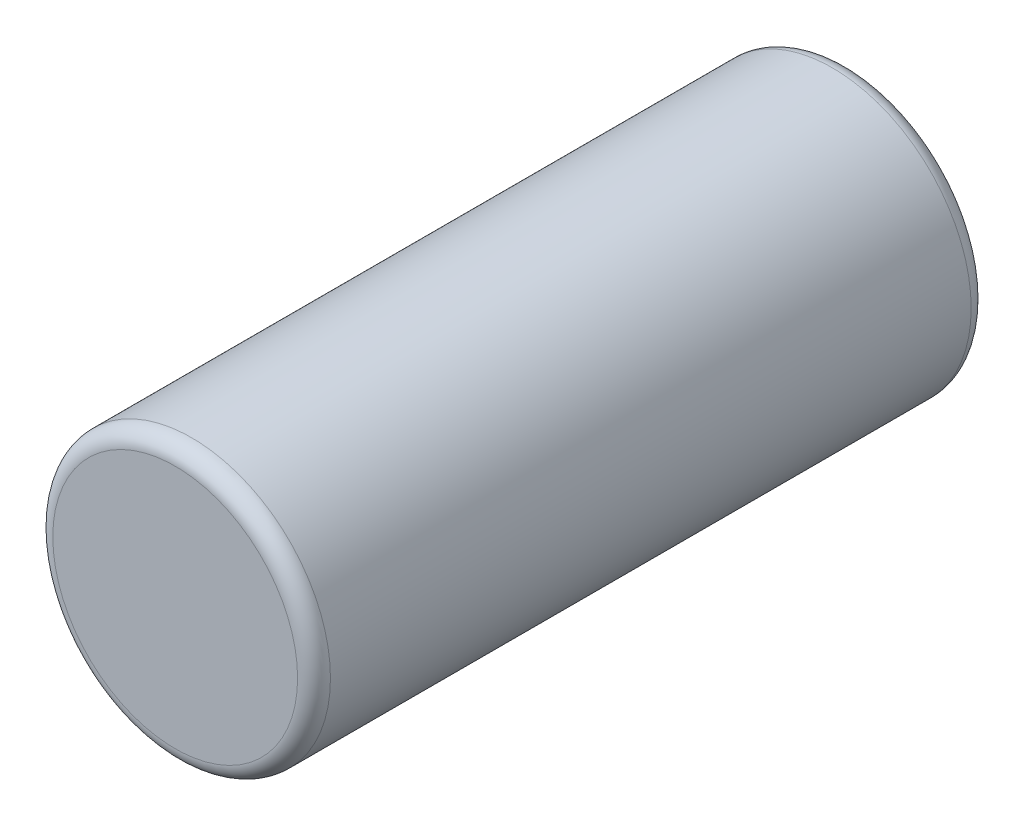
ISO-10303-21;
HEADER;
FILE_DESCRIPTION(('STEP AP214'),'2;1');
FILE_NAME('part.step','',(''),(''),'','','');
FILE_SCHEMA(('AUTOMOTIVE_DESIGN { 1 0 10303 214 1 1 1 1 }'));
ENDSEC;
DATA;
#1=APPLICATION_CONTEXT('core data for automotive mechanical design processes');
#2=APPLICATION_PROTOCOL_DEFINITION('international standard','automotive_design',2000,#1);
#3=PRODUCT_CONTEXT('',#1,'mechanical');
#4=PRODUCT('Part','Part','',(#3));
#5=PRODUCT_RELATED_PRODUCT_CATEGORY('part','',(#4));
#6=PRODUCT_DEFINITION_FORMATION('','',#4);
#7=PRODUCT_DEFINITION_CONTEXT('part definition',#1,'design');
#8=PRODUCT_DEFINITION('design','',#6,#7);
#9=PRODUCT_DEFINITION_SHAPE('','',#8);
#10=(LENGTH_UNIT() NAMED_UNIT(*) SI_UNIT(.MILLI.,.METRE.));
#11=(NAMED_UNIT(*) PLANE_ANGLE_UNIT() SI_UNIT($,.RADIAN.));
#12=(NAMED_UNIT(*) SI_UNIT($,.STERADIAN.) SOLID_ANGLE_UNIT());
#13=UNCERTAINTY_MEASURE_WITH_UNIT(LENGTH_MEASURE(1.E-05),#10,'distance_accuracy_value','');
#14=(GEOMETRIC_REPRESENTATION_CONTEXT(3) GLOBAL_UNCERTAINTY_ASSIGNED_CONTEXT((#13)) GLOBAL_UNIT_ASSIGNED_CONTEXT((#10,
#11,#12)) REPRESENTATION_CONTEXT('',''));
#15=CARTESIAN_POINT('',(0.,0.,0.));
#16=DIRECTION('',(0.,0.,1.));
#17=DIRECTION('',(1.,0.,0.));
#18=AXIS2_PLACEMENT_3D('',#15,#16,#17);
#19=CARTESIAN_POINT('',(0.,0.,41.));
#20=DIRECTION('',(0.,0.,-1.));
#21=DIRECTION('',(-1.,0.,0.));
#22=AXIS2_PLACEMENT_3D('',#19,#20,#21);
#23=CYLINDRICAL_SURFACE('',#22,16.9);
#24=CARTESIAN_POINT('',(0.,0.,-39.));
#25=DIRECTION('',(0.,0.,1.));
#26=DIRECTION('',(1.,0.,0.));
#27=AXIS2_PLACEMENT_3D('',#24,#25,#26);
#28=CIRCLE('',#27,16.9);
#29=CARTESIAN_POINT('',(16.9,0.,-39.));
#30=VERTEX_POINT('',#29);
#31=EDGE_CURVE('E58',#30,#30,#28,.T.);
#32=ORIENTED_EDGE('',*,*,#31,.T.);
#33=EDGE_LOOP('',(#32));
#34=FACE_BOUND('',#33,.T.);
#35=CARTESIAN_POINT('',(0.,0.,39.));
#36=DIRECTION('',(0.,0.,1.));
#37=DIRECTION('',(1.,0.,0.));
#38=AXIS2_PLACEMENT_3D('',#35,#36,#37);
#39=CIRCLE('',#38,16.9);
#40=CARTESIAN_POINT('',(16.9,0.,39.));
#41=VERTEX_POINT('',#40);
#42=EDGE_CURVE('E63',#41,#41,#39,.F.);
#43=ORIENTED_EDGE('',*,*,#42,.T.);
#44=EDGE_LOOP('',(#43));
#45=FACE_BOUND('',#44,.T.);
#46=ADVANCED_FACE('F50',(#34,#45),#23,.T.);
#47=CARTESIAN_POINT('',(0.,0.,41.));
#48=DIRECTION('',(0.,0.,1.));
#49=DIRECTION('',(1.,0.,0.));
#50=AXIS2_PLACEMENT_3D('',#47,#48,#49);
#51=PLANE('',#50);
#52=CARTESIAN_POINT('',(0.,0.,41.));
#53=DIRECTION('',(0.,0.,1.));
#54=DIRECTION('',(1.,0.,0.));
#55=AXIS2_PLACEMENT_3D('',#52,#53,#54);
#56=CIRCLE('',#55,14.9);
#57=CARTESIAN_POINT('',(14.9,0.,41.));
#58=VERTEX_POINT('',#57);
#59=EDGE_CURVE('E10',#58,#58,#56,.T.);
#60=ORIENTED_EDGE('',*,*,#59,.T.);
#61=EDGE_LOOP('',(#60));
#62=FACE_BOUND('',#61,.T.);
#63=ADVANCED_FACE('F85',(#62),#51,.T.);
#64=CARTESIAN_POINT('',(0.,0.,-41.));
#65=DIRECTION('',(0.,0.,1.));
#66=DIRECTION('',(1.,0.,0.));
#67=AXIS2_PLACEMENT_3D('',#64,#65,#66);
#68=PLANE('',#67);
#69=CARTESIAN_POINT('',(0.,0.,-41.));
#70=DIRECTION('',(0.,0.,1.));
#71=DIRECTION('',(1.,0.,0.));
#72=AXIS2_PLACEMENT_3D('',#69,#70,#71);
#73=CIRCLE('',#72,14.9);
#74=CARTESIAN_POINT('',(14.9,0.,-41.));
#75=VERTEX_POINT('',#74);
#76=EDGE_CURVE('E54',#75,#75,#73,.F.);
#77=ORIENTED_EDGE('',*,*,#76,.T.);
#78=EDGE_LOOP('',(#77));
#79=FACE_BOUND('',#78,.T.);
#80=ADVANCED_FACE('F76',(#79),#68,.F.);
#81=CARTESIAN_POINT('',(0.,0.,-39.));
#82=DIRECTION('',(0.,0.,1.));
#83=DIRECTION('',(1.,0.,0.));
#84=AXIS2_PLACEMENT_3D('',#81,#82,#83);
#85=TOROIDAL_SURFACE('',#84,14.9,2.);
#86=ORIENTED_EDGE('',*,*,#76,.F.);
#87=EDGE_LOOP('',(#86));
#88=FACE_BOUND('',#87,.T.);
#89=ORIENTED_EDGE('',*,*,#31,.F.);
#90=EDGE_LOOP('',(#89));
#91=FACE_BOUND('',#90,.T.);
#92=ADVANCED_FACE('F73',(#88,#91),#85,.T.);
#93=CARTESIAN_POINT('',(0.,0.,39.));
#94=DIRECTION('',(0.,0.,1.));
#95=DIRECTION('',(1.,0.,0.));
#96=AXIS2_PLACEMENT_3D('',#93,#94,#95);
#97=TOROIDAL_SURFACE('',#96,14.9,2.);
#98=ORIENTED_EDGE('',*,*,#42,.F.);
#99=EDGE_LOOP('',(#98));
#100=FACE_BOUND('',#99,.T.);
#101=ORIENTED_EDGE('',*,*,#59,.F.);
#102=EDGE_LOOP('',(#101));
#103=FACE_BOUND('',#102,.T.);
#104=ADVANCED_FACE('F47',(#100,#103),#97,.T.);
#105=CLOSED_SHELL('',(#46,#63,#80,#92,#104));
#106=MANIFOLD_SOLID_BREP('B2',#105);
#107=ADVANCED_BREP_SHAPE_REPRESENTATION('',(#18,#106),#14);
#108=SHAPE_DEFINITION_REPRESENTATION(#9,#107);
ENDSEC;
END-ISO-10303-21;
